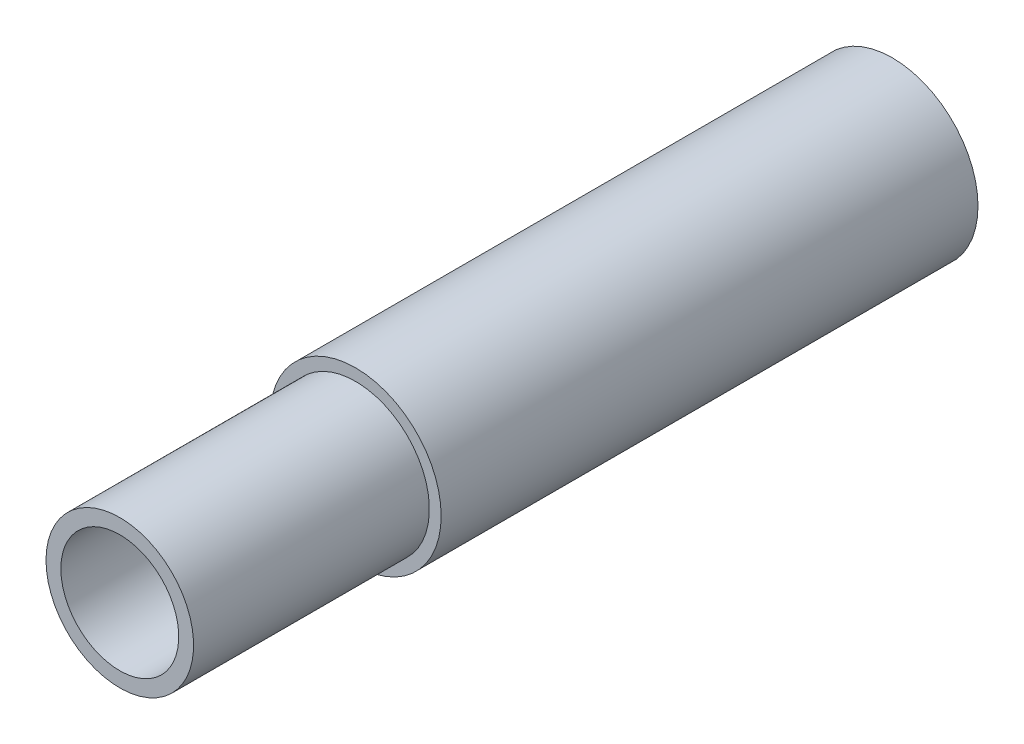
ISO-10303-21;
HEADER;
FILE_DESCRIPTION(('STEP AP214'),'2;1');
FILE_NAME('part.step','',(''),(''),'','','');
FILE_SCHEMA(('AUTOMOTIVE_DESIGN { 1 0 10303 214 1 1 1 1 }'));
ENDSEC;
DATA;
#1=APPLICATION_CONTEXT('core data for automotive mechanical design processes');
#2=APPLICATION_PROTOCOL_DEFINITION('international standard','automotive_design',2000,#1);
#3=PRODUCT_CONTEXT('',#1,'mechanical');
#4=PRODUCT('Part','Part','',(#3));
#5=PRODUCT_RELATED_PRODUCT_CATEGORY('part','',(#4));
#6=PRODUCT_DEFINITION_FORMATION('','',#4);
#7=PRODUCT_DEFINITION_CONTEXT('part definition',#1,'design');
#8=PRODUCT_DEFINITION('design','',#6,#7);
#9=PRODUCT_DEFINITION_SHAPE('','',#8);
#10=(LENGTH_UNIT() NAMED_UNIT(*) SI_UNIT(.MILLI.,.METRE.));
#11=(NAMED_UNIT(*) PLANE_ANGLE_UNIT() SI_UNIT($,.RADIAN.));
#12=(NAMED_UNIT(*) SI_UNIT($,.STERADIAN.) SOLID_ANGLE_UNIT());
#13=UNCERTAINTY_MEASURE_WITH_UNIT(LENGTH_MEASURE(1.E-05),#10,'distance_accuracy_value','');
#14=(GEOMETRIC_REPRESENTATION_CONTEXT(3) GLOBAL_UNCERTAINTY_ASSIGNED_CONTEXT((#13)) GLOBAL_UNIT_ASSIGNED_CONTEXT((#10,
#11,#12)) REPRESENTATION_CONTEXT('',''));
#15=CARTESIAN_POINT('',(0.,0.,0.));
#16=DIRECTION('',(0.,0.,1.));
#17=DIRECTION('',(1.,0.,0.));
#18=AXIS2_PLACEMENT_3D('',#15,#16,#17);
#19=CARTESIAN_POINT('',(0.,0.,0.));
#20=DIRECTION('',(0.,0.,-1.));
#21=DIRECTION('',(-1.,0.,0.));
#22=AXIS2_PLACEMENT_3D('',#19,#20,#21);
#23=PLANE('',#22);
#24=CARTESIAN_POINT('',(0.,0.,0.));
#25=DIRECTION('',(0.,0.,-1.));
#26=DIRECTION('',(-1.,0.,0.));
#27=AXIS2_PLACEMENT_3D('',#24,#25,#26);
#28=CIRCLE('',#27,7.9375);
#29=CARTESIAN_POINT('',(-7.9375,0.,0.));
#30=VERTEX_POINT('',#29);
#31=EDGE_CURVE('E73',#30,#30,#28,.F.);
#32=ORIENTED_EDGE('',*,*,#31,.F.);
#33=EDGE_LOOP('',(#32));
#34=FACE_BOUND('',#33,.T.);
#35=CARTESIAN_POINT('',(0.,0.,0.));
#36=DIRECTION('',(0.,0.,-1.));
#37=DIRECTION('',(-1.,0.,0.));
#38=AXIS2_PLACEMENT_3D('',#35,#36,#37);
#39=CIRCLE('',#38,9.9375);
#40=CARTESIAN_POINT('',(-9.9375,0.,0.));
#41=VERTEX_POINT('',#40);
#42=EDGE_CURVE('E69',#41,#41,#39,.T.);
#43=ORIENTED_EDGE('',*,*,#42,.F.);
#44=EDGE_LOOP('',(#43));
#45=FACE_BOUND('',#44,.T.);
#46=ADVANCED_FACE('F63',(#34,#45),#23,.F.);
#47=CARTESIAN_POINT('',(0.,0.,0.));
#48=DIRECTION('',(0.,0.,-1.));
#49=DIRECTION('',(-1.,0.,0.));
#50=AXIS2_PLACEMENT_3D('',#47,#48,#49);
#51=CYLINDRICAL_SURFACE('',#50,9.9375);
#52=CARTESIAN_POINT('',(0.,0.,-31.75));
#53=DIRECTION('',(0.,0.,-1.));
#54=DIRECTION('',(-1.,0.,0.));
#55=AXIS2_PLACEMENT_3D('',#52,#53,#54);
#56=CIRCLE('',#55,9.9375);
#57=CARTESIAN_POINT('',(-9.9375,0.,-31.75));
#58=VERTEX_POINT('',#57);
#59=EDGE_CURVE('E11',#58,#58,#56,.T.);
#60=ORIENTED_EDGE('',*,*,#59,.F.);
#61=EDGE_LOOP('',(#60));
#62=FACE_BOUND('',#61,.T.);
#63=ORIENTED_EDGE('',*,*,#42,.T.);
#64=EDGE_LOOP('',(#63));
#65=FACE_BOUND('',#64,.T.);
#66=ADVANCED_FACE('F108',(#62,#65),#51,.T.);
#67=CARTESIAN_POINT('',(0.,0.,4.));
#68=DIRECTION('',(0.,0.,-1.));
#69=DIRECTION('',(-1.,0.,0.));
#70=AXIS2_PLACEMENT_3D('',#67,#68,#69);
#71=CYLINDRICAL_SURFACE('',#70,7.9375);
#72=ORIENTED_EDGE('',*,*,#31,.T.);
#73=EDGE_LOOP('',(#72));
#74=FACE_BOUND('',#73,.T.);
#75=CARTESIAN_POINT('',(0.,0.,-31.75));
#76=DIRECTION('',(0.,0.,-1.));
#77=DIRECTION('',(-1.,0.,0.));
#78=AXIS2_PLACEMENT_3D('',#75,#76,#77);
#79=CIRCLE('',#78,7.9375);
#80=CARTESIAN_POINT('',(-7.9375,0.,-31.75));
#81=VERTEX_POINT('',#80);
#82=EDGE_CURVE('E80',#81,#81,#79,.F.);
#83=ORIENTED_EDGE('',*,*,#82,.F.);
#84=EDGE_LOOP('',(#83));
#85=FACE_BOUND('',#84,.T.);
#86=ADVANCED_FACE('F105',(#74,#85),#71,.F.);
#87=CARTESIAN_POINT('',(0.,0.,-31.75));
#88=DIRECTION('',(0.,0.,-1.));
#89=DIRECTION('',(-1.,0.,0.));
#90=AXIS2_PLACEMENT_3D('',#87,#88,#89);
#91=CYLINDRICAL_SURFACE('',#90,11.525);
#92=CARTESIAN_POINT('',(0.,0.,-104.0384));
#93=DIRECTION('',(0.,0.,-1.));
#94=DIRECTION('',(-1.,0.,0.));
#95=AXIS2_PLACEMENT_3D('',#92,#93,#94);
#96=CIRCLE('',#95,11.525);
#97=CARTESIAN_POINT('',(-11.525,0.,-104.0384));
#98=VERTEX_POINT('',#97);
#99=EDGE_CURVE('E77',#98,#98,#96,.T.);
#100=ORIENTED_EDGE('',*,*,#99,.F.);
#101=EDGE_LOOP('',(#100));
#102=FACE_BOUND('',#101,.T.);
#103=CARTESIAN_POINT('',(0.,0.,-31.75));
#104=DIRECTION('',(0.,0.,-1.));
#105=DIRECTION('',(-1.,0.,0.));
#106=AXIS2_PLACEMENT_3D('',#103,#104,#105);
#107=CIRCLE('',#106,11.525);
#108=CARTESIAN_POINT('',(-11.525,0.,-31.75));
#109=VERTEX_POINT('',#108);
#110=EDGE_CURVE('E82',#109,#109,#107,.T.);
#111=ORIENTED_EDGE('',*,*,#110,.T.);
#112=EDGE_LOOP('',(#111));
#113=FACE_BOUND('',#112,.T.);
#114=ADVANCED_FACE('F107',(#102,#113),#91,.T.);
#115=CARTESIAN_POINT('',(0.,0.,-104.0384));
#116=DIRECTION('',(0.,0.,-1.));
#117=DIRECTION('',(-1.,0.,0.));
#118=AXIS2_PLACEMENT_3D('',#115,#116,#117);
#119=PLANE('',#118);
#120=CARTESIAN_POINT('',(0.,0.,-104.0384));
#121=DIRECTION('',(0.,0.,-1.));
#122=DIRECTION('',(-1.,0.,0.));
#123=AXIS2_PLACEMENT_3D('',#120,#121,#122);
#124=CIRCLE('',#123,9.525);
#125=CARTESIAN_POINT('',(-9.52500000000002,0.,-104.0384));
#126=VERTEX_POINT('',#125);
#127=EDGE_CURVE('E83',#126,#126,#124,.F.);
#128=ORIENTED_EDGE('',*,*,#127,.T.);
#129=EDGE_LOOP('',(#128));
#130=FACE_BOUND('',#129,.T.);
#131=ORIENTED_EDGE('',*,*,#99,.T.);
#132=EDGE_LOOP('',(#131));
#133=FACE_BOUND('',#132,.T.);
#134=ADVANCED_FACE('F115',(#130,#133),#119,.T.);
#135=CARTESIAN_POINT('',(0.,0.,-31.75));
#136=DIRECTION('',(0.,0.,-1.));
#137=DIRECTION('',(-1.,0.,0.));
#138=AXIS2_PLACEMENT_3D('',#135,#136,#137);
#139=PLANE('',#138);
#140=ORIENTED_EDGE('',*,*,#59,.T.);
#141=EDGE_LOOP('',(#140));
#142=FACE_BOUND('',#141,.T.);
#143=ORIENTED_EDGE('',*,*,#110,.F.);
#144=EDGE_LOOP('',(#143));
#145=FACE_BOUND('',#144,.T.);
#146=ADVANCED_FACE('F101',(#142,#145),#139,.F.);
#147=CARTESIAN_POINT('',(0.,0.,-31.75));
#148=DIRECTION('',(0.,0.,-1.));
#149=DIRECTION('',(-1.,0.,0.));
#150=AXIS2_PLACEMENT_3D('',#147,#148,#149);
#151=PLANE('',#150);
#152=CARTESIAN_POINT('',(0.,0.,-31.75));
#153=DIRECTION('',(0.,0.,-1.));
#154=DIRECTION('',(-1.,0.,0.));
#155=AXIS2_PLACEMENT_3D('',#152,#153,#154);
#156=CIRCLE('',#155,9.525);
#157=CARTESIAN_POINT('',(-9.525,0.,-31.75));
#158=VERTEX_POINT('',#157);
#159=EDGE_CURVE('E91',#158,#158,#156,.F.);
#160=ORIENTED_EDGE('',*,*,#159,.F.);
#161=EDGE_LOOP('',(#160));
#162=FACE_BOUND('',#161,.T.);
#163=ORIENTED_EDGE('',*,*,#82,.T.);
#164=EDGE_LOOP('',(#163));
#165=FACE_BOUND('',#164,.T.);
#166=ADVANCED_FACE('F98',(#162,#165),#151,.T.);
#167=CARTESIAN_POINT('',(0.,0.,-26.75));
#168=DIRECTION('',(0.,0.,-1.));
#169=DIRECTION('',(-1.,0.,0.));
#170=AXIS2_PLACEMENT_3D('',#167,#168,#169);
#171=CYLINDRICAL_SURFACE('',#170,9.525);
#172=ORIENTED_EDGE('',*,*,#159,.T.);
#173=EDGE_LOOP('',(#172));
#174=FACE_BOUND('',#173,.T.);
#175=ORIENTED_EDGE('',*,*,#127,.F.);
#176=EDGE_LOOP('',(#175));
#177=FACE_BOUND('',#176,.T.);
#178=ADVANCED_FACE('F95',(#174,#177),#171,.F.);
#179=CLOSED_SHELL('',(#46,#66,#86,#114,#134,#146,#166,#178));
#180=MANIFOLD_SOLID_BREP('B2',#179);
#181=ADVANCED_BREP_SHAPE_REPRESENTATION('',(#18,#180),#14);
#182=SHAPE_DEFINITION_REPRESENTATION(#9,#181);
ENDSEC;
END-ISO-10303-21;
